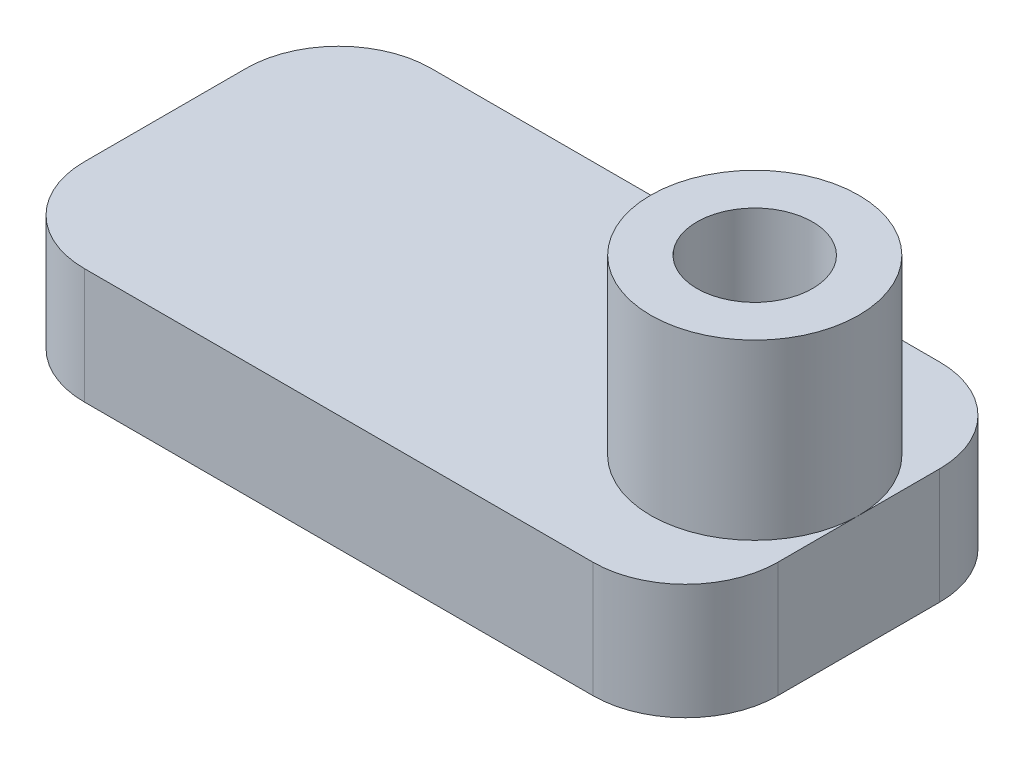
ISO-10303-21;
HEADER;
FILE_DESCRIPTION(('STEP AP214'),'2;1');
FILE_NAME('part.step','',(''),(''),'','','');
FILE_SCHEMA(('AUTOMOTIVE_DESIGN { 1 0 10303 214 1 1 1 1 }'));
ENDSEC;
DATA;
#1=APPLICATION_CONTEXT('core data for automotive mechanical design processes');
#2=APPLICATION_PROTOCOL_DEFINITION('international standard','automotive_design',2000,#1);
#3=PRODUCT_CONTEXT('',#1,'mechanical');
#4=PRODUCT('Part','Part','',(#3));
#5=PRODUCT_RELATED_PRODUCT_CATEGORY('part','',(#4));
#6=PRODUCT_DEFINITION_FORMATION('','',#4);
#7=PRODUCT_DEFINITION_CONTEXT('part definition',#1,'design');
#8=PRODUCT_DEFINITION('design','',#6,#7);
#9=PRODUCT_DEFINITION_SHAPE('','',#8);
#10=(LENGTH_UNIT() NAMED_UNIT(*) SI_UNIT(.MILLI.,.METRE.));
#11=(NAMED_UNIT(*) PLANE_ANGLE_UNIT() SI_UNIT($,.RADIAN.));
#12=(NAMED_UNIT(*) SI_UNIT($,.STERADIAN.) SOLID_ANGLE_UNIT());
#13=UNCERTAINTY_MEASURE_WITH_UNIT(LENGTH_MEASURE(1.E-05),#10,'distance_accuracy_value','');
#14=(GEOMETRIC_REPRESENTATION_CONTEXT(3) GLOBAL_UNCERTAINTY_ASSIGNED_CONTEXT((#13)) GLOBAL_UNIT_ASSIGNED_CONTEXT((#10,
#11,#12)) REPRESENTATION_CONTEXT('',''));
#15=CARTESIAN_POINT('',(0.,0.,0.));
#16=DIRECTION('',(0.,0.,1.));
#17=DIRECTION('',(1.,0.,0.));
#18=AXIS2_PLACEMENT_3D('',#15,#16,#17);
#19=CARTESIAN_POINT('',(9.,10.,0.));
#20=DIRECTION('',(1.,0.,0.));
#21=DIRECTION('',(0.,0.,-1.));
#22=AXIS2_PLACEMENT_3D('',#19,#20,#21);
#23=PLANE('',#22);
#24=DIRECTION('',(0.,0.,1.));
#25=VECTOR('',#24,1.);
#26=CARTESIAN_POINT('',(9.,10.,0.));
#27=LINE('',#26,#25);
#28=CARTESIAN_POINT('',(9.,10.,-7.));
#29=VERTEX_POINT('',#28);
#30=CARTESIAN_POINT('',(9.,10.,0.));
#31=VERTEX_POINT('',#30);
#32=EDGE_CURVE('E219',#29,#31,#27,.T.);
#33=ORIENTED_EDGE('',*,*,#32,.T.);
#34=CARTESIAN_POINT('',(9.,10.,7.));
#35=VERTEX_POINT('',#34);
#36=EDGE_CURVE('E136',#31,#35,#27,.T.);
#37=ORIENTED_EDGE('',*,*,#36,.T.);
#38=DIRECTION('',(0.,-1.,0.));
#39=VECTOR('',#38,1.);
#40=CARTESIAN_POINT('',(9.,0.,7.));
#41=LINE('',#40,#39);
#42=CARTESIAN_POINT('',(9.,0.,7.));
#43=VERTEX_POINT('',#42);
#44=EDGE_CURVE('E45',#35,#43,#41,.T.);
#45=ORIENTED_EDGE('',*,*,#44,.T.);
#46=DIRECTION('',(0.,0.,1.));
#47=VECTOR('',#46,1.);
#48=CARTESIAN_POINT('',(9.,0.,0.));
#49=LINE('',#48,#47);
#50=CARTESIAN_POINT('',(9.,0.,-7.));
#51=VERTEX_POINT('',#50);
#52=EDGE_CURVE('E167',#51,#43,#49,.T.);
#53=ORIENTED_EDGE('',*,*,#52,.F.);
#54=DIRECTION('',(0.,-1.,0.));
#55=VECTOR('',#54,1.);
#56=CARTESIAN_POINT('',(9.,10.,-7.));
#57=LINE('',#56,#55);
#58=EDGE_CURVE('E11',#51,#29,#57,.F.);
#59=ORIENTED_EDGE('',*,*,#58,.T.);
#60=EDGE_LOOP('',(#33,#37,#45,#53,#59));
#61=FACE_BOUND('',#60,.T.);
#62=ADVANCED_FACE('F37',(#61),#23,.T.);
#63=CARTESIAN_POINT('',(0.,10.,-15.));
#64=DIRECTION('',(0.,0.,-1.));
#65=DIRECTION('',(-1.,0.,0.));
#66=AXIS2_PLACEMENT_3D('',#63,#64,#65);
#67=PLANE('',#66);
#68=DIRECTION('',(1.,0.,0.));
#69=VECTOR('',#68,1.);
#70=CARTESIAN_POINT('',(0.,0.,-15.));
#71=LINE('',#70,#69);
#72=CARTESIAN_POINT('',(-43.,0.,-15.));
#73=VERTEX_POINT('',#72);
#74=CARTESIAN_POINT('',(1.,0.,-15.));
#75=VERTEX_POINT('',#74);
#76=EDGE_CURVE('E138',#73,#75,#71,.T.);
#77=ORIENTED_EDGE('',*,*,#76,.F.);
#78=DIRECTION('',(0.,-1.,0.));
#79=VECTOR('',#78,1.);
#80=CARTESIAN_POINT('',(-43.,10.,-15.));
#81=LINE('',#80,#79);
#82=CARTESIAN_POINT('',(-43.,10.,-15.));
#83=VERTEX_POINT('',#82);
#84=EDGE_CURVE('E161',#73,#83,#81,.F.);
#85=ORIENTED_EDGE('',*,*,#84,.T.);
#86=DIRECTION('',(1.,0.,0.));
#87=VECTOR('',#86,1.);
#88=CARTESIAN_POINT('',(0.,10.,-15.));
#89=LINE('',#88,#87);
#90=CARTESIAN_POINT('',(1.,10.,-15.));
#91=VERTEX_POINT('',#90);
#92=EDGE_CURVE('E176',#83,#91,#89,.T.);
#93=ORIENTED_EDGE('',*,*,#92,.T.);
#94=DIRECTION('',(0.,-1.,0.));
#95=VECTOR('',#94,1.);
#96=CARTESIAN_POINT('',(1.,10.,-15.));
#97=LINE('',#96,#95);
#98=EDGE_CURVE('E158',#91,#75,#97,.T.);
#99=ORIENTED_EDGE('',*,*,#98,.T.);
#100=EDGE_LOOP('',(#77,#85,#93,#99));
#101=FACE_BOUND('',#100,.T.);
#102=ADVANCED_FACE('F184',(#101),#67,.T.);
#103=CARTESIAN_POINT('',(-51.,10.,0.));
#104=DIRECTION('',(1.,0.,0.));
#105=DIRECTION('',(0.,0.,-1.));
#106=AXIS2_PLACEMENT_3D('',#103,#104,#105);
#107=PLANE('',#106);
#108=DIRECTION('',(0.,0.,1.));
#109=VECTOR('',#108,1.);
#110=CARTESIAN_POINT('',(-51.,0.,0.));
#111=LINE('',#110,#109);
#112=CARTESIAN_POINT('',(-51.,0.,-7.));
#113=VERTEX_POINT('',#112);
#114=CARTESIAN_POINT('',(-51.,0.,7.));
#115=VERTEX_POINT('',#114);
#116=EDGE_CURVE('E133',#113,#115,#111,.T.);
#117=ORIENTED_EDGE('',*,*,#116,.T.);
#118=DIRECTION('',(0.,-1.,0.));
#119=VECTOR('',#118,1.);
#120=CARTESIAN_POINT('',(-51.,10.,7.));
#121=LINE('',#120,#119);
#122=CARTESIAN_POINT('',(-51.,10.,7.));
#123=VERTEX_POINT('',#122);
#124=EDGE_CURVE('E110',#115,#123,#121,.F.);
#125=ORIENTED_EDGE('',*,*,#124,.T.);
#126=DIRECTION('',(0.,0.,1.));
#127=VECTOR('',#126,1.);
#128=CARTESIAN_POINT('',(-51.,10.,0.));
#129=LINE('',#128,#127);
#130=CARTESIAN_POINT('',(-51.,10.,-7.));
#131=VERTEX_POINT('',#130);
#132=EDGE_CURVE('E174',#131,#123,#129,.T.);
#133=ORIENTED_EDGE('',*,*,#132,.F.);
#134=DIRECTION('',(0.,-1.,0.));
#135=VECTOR('',#134,1.);
#136=CARTESIAN_POINT('',(-51.,0.,-7.));
#137=LINE('',#136,#135);
#138=EDGE_CURVE('E115',#131,#113,#137,.T.);
#139=ORIENTED_EDGE('',*,*,#138,.T.);
#140=EDGE_LOOP('',(#117,#125,#133,#139));
#141=FACE_BOUND('',#140,.T.);
#142=ADVANCED_FACE('F192',(#141),#107,.F.);
#143=CARTESIAN_POINT('',(0.,10.,15.));
#144=DIRECTION('',(0.,0.,-1.));
#145=DIRECTION('',(-1.,0.,0.));
#146=AXIS2_PLACEMENT_3D('',#143,#144,#145);
#147=PLANE('',#146);
#148=DIRECTION('',(1.,0.,0.));
#149=VECTOR('',#148,1.);
#150=CARTESIAN_POINT('',(0.,10.,15.));
#151=LINE('',#150,#149);
#152=CARTESIAN_POINT('',(-43.,10.,15.));
#153=VERTEX_POINT('',#152);
#154=CARTESIAN_POINT('',(1.,10.,15.));
#155=VERTEX_POINT('',#154);
#156=EDGE_CURVE('E125',#153,#155,#151,.T.);
#157=ORIENTED_EDGE('',*,*,#156,.F.);
#158=DIRECTION('',(0.,-1.,0.));
#159=VECTOR('',#158,1.);
#160=CARTESIAN_POINT('',(-43.,10.,15.));
#161=LINE('',#160,#159);
#162=CARTESIAN_POINT('',(-43.,0.,15.));
#163=VERTEX_POINT('',#162);
#164=EDGE_CURVE('E109',#153,#163,#161,.T.);
#165=ORIENTED_EDGE('',*,*,#164,.T.);
#166=DIRECTION('',(1.,0.,0.));
#167=VECTOR('',#166,1.);
#168=CARTESIAN_POINT('',(0.,0.,15.));
#169=LINE('',#168,#167);
#170=CARTESIAN_POINT('',(1.,0.,15.));
#171=VERTEX_POINT('',#170);
#172=EDGE_CURVE('E122',#163,#171,#169,.T.);
#173=ORIENTED_EDGE('',*,*,#172,.T.);
#174=DIRECTION('',(0.,-1.,0.));
#175=VECTOR('',#174,1.);
#176=CARTESIAN_POINT('',(1.,10.,15.));
#177=LINE('',#176,#175);
#178=EDGE_CURVE('E127',#171,#155,#177,.F.);
#179=ORIENTED_EDGE('',*,*,#178,.T.);
#180=EDGE_LOOP('',(#157,#165,#173,#179));
#181=FACE_BOUND('',#180,.T.);
#182=ADVANCED_FACE('F121',(#181),#147,.F.);
#183=CARTESIAN_POINT('',(0.,10.,0.));
#184=DIRECTION('',(0.,-1.,0.));
#185=DIRECTION('',(0.,0.,-1.));
#186=AXIS2_PLACEMENT_3D('',#183,#184,#185);
#187=CYLINDRICAL_SURFACE('',#186,5.);
#188=CARTESIAN_POINT('',(0.,0.,0.));
#189=DIRECTION('',(0.,1.,0.));
#190=DIRECTION('',(0.,0.,1.));
#191=AXIS2_PLACEMENT_3D('',#188,#189,#190);
#192=CIRCLE('',#191,5.);
#193=CARTESIAN_POINT('',(0.,0.,5.));
#194=VERTEX_POINT('',#193);
#195=EDGE_CURVE('E132',#194,#194,#192,.T.);
#196=ORIENTED_EDGE('',*,*,#195,.F.);
#197=EDGE_LOOP('',(#196));
#198=FACE_BOUND('',#197,.T.);
#199=CARTESIAN_POINT('',(0.,25.,0.));
#200=DIRECTION('',(0.,1.,0.));
#201=DIRECTION('',(0.,0.,1.));
#202=AXIS2_PLACEMENT_3D('',#199,#200,#201);
#203=CIRCLE('',#202,5.);
#204=CARTESIAN_POINT('',(0.,25.,5.));
#205=VERTEX_POINT('',#204);
#206=EDGE_CURVE('E226',#205,#205,#203,.T.);
#207=ORIENTED_EDGE('',*,*,#206,.T.);
#208=EDGE_LOOP('',(#207));
#209=FACE_BOUND('',#208,.T.);
#210=ADVANCED_FACE('F199',(#198,#209),#187,.F.);
#211=CARTESIAN_POINT('',(0.,10.,0.));
#212=DIRECTION('',(0.,1.,0.));
#213=DIRECTION('',(0.,0.,1.));
#214=AXIS2_PLACEMENT_3D('',#211,#212,#213);
#215=PLANE('',#214);
#216=ORIENTED_EDGE('',*,*,#36,.F.);
#217=CARTESIAN_POINT('',(0.,10.,0.));
#218=DIRECTION('',(0.,1.,0.));
#219=DIRECTION('',(0.,0.,1.));
#220=AXIS2_PLACEMENT_3D('',#217,#218,#219);
#221=CIRCLE('',#220,9.);
#222=EDGE_CURVE('E50',#31,#31,#221,.F.);
#223=ORIENTED_EDGE('',*,*,#222,.T.);
#224=ORIENTED_EDGE('',*,*,#32,.F.);
#225=CARTESIAN_POINT('',(1.,10.,-7.));
#226=DIRECTION('',(0.,1.,0.));
#227=DIRECTION('',(0.,0.,1.));
#228=AXIS2_PLACEMENT_3D('',#225,#226,#227);
#229=CIRCLE('',#228,8.);
#230=EDGE_CURVE('E57',#29,#91,#229,.T.);
#231=ORIENTED_EDGE('',*,*,#230,.T.);
#232=ORIENTED_EDGE('',*,*,#92,.F.);
#233=CARTESIAN_POINT('',(-43.,10.,-7.));
#234=DIRECTION('',(0.,1.,0.));
#235=DIRECTION('',(0.,0.,1.));
#236=AXIS2_PLACEMENT_3D('',#233,#234,#235);
#237=CIRCLE('',#236,8.);
#238=EDGE_CURVE('E154',#83,#131,#237,.T.);
#239=ORIENTED_EDGE('',*,*,#238,.T.);
#240=ORIENTED_EDGE('',*,*,#132,.T.);
#241=CARTESIAN_POINT('',(-43.,10.,7.));
#242=DIRECTION('',(0.,1.,0.));
#243=DIRECTION('',(0.,0.,1.));
#244=AXIS2_PLACEMENT_3D('',#241,#242,#243);
#245=CIRCLE('',#244,8.);
#246=EDGE_CURVE('E156',#123,#153,#245,.T.);
#247=ORIENTED_EDGE('',*,*,#246,.T.);
#248=ORIENTED_EDGE('',*,*,#156,.T.);
#249=CARTESIAN_POINT('',(1.,10.,7.));
#250=DIRECTION('',(0.,1.,0.));
#251=DIRECTION('',(0.,0.,1.));
#252=AXIS2_PLACEMENT_3D('',#249,#250,#251);
#253=CIRCLE('',#252,8.);
#254=EDGE_CURVE('E150',#155,#35,#253,.T.);
#255=ORIENTED_EDGE('',*,*,#254,.T.);
#256=EDGE_LOOP('',(#216,#223,#224,#231,#232,#239,#240,#247,#248,#255));
#257=FACE_BOUND('',#256,.T.);
#258=ADVANCED_FACE('F172',(#257),#215,.T.);
#259=CARTESIAN_POINT('',(0.,0.,0.));
#260=DIRECTION('',(0.,1.,0.));
#261=DIRECTION('',(0.,0.,1.));
#262=AXIS2_PLACEMENT_3D('',#259,#260,#261);
#263=PLANE('',#262);
#264=ORIENTED_EDGE('',*,*,#52,.T.);
#265=CARTESIAN_POINT('',(1.,0.,7.));
#266=DIRECTION('',(0.,1.,0.));
#267=DIRECTION('',(0.,0.,1.));
#268=AXIS2_PLACEMENT_3D('',#265,#266,#267);
#269=CIRCLE('',#268,8.);
#270=EDGE_CURVE('E126',#43,#171,#269,.F.);
#271=ORIENTED_EDGE('',*,*,#270,.T.);
#272=ORIENTED_EDGE('',*,*,#172,.F.);
#273=CARTESIAN_POINT('',(-43.,0.,7.));
#274=DIRECTION('',(0.,1.,0.));
#275=DIRECTION('',(0.,0.,1.));
#276=AXIS2_PLACEMENT_3D('',#273,#274,#275);
#277=CIRCLE('',#276,8.);
#278=EDGE_CURVE('E105',#163,#115,#277,.F.);
#279=ORIENTED_EDGE('',*,*,#278,.T.);
#280=ORIENTED_EDGE('',*,*,#116,.F.);
#281=CARTESIAN_POINT('',(-43.,0.,-7.));
#282=DIRECTION('',(0.,1.,0.));
#283=DIRECTION('',(0.,0.,1.));
#284=AXIS2_PLACEMENT_3D('',#281,#282,#283);
#285=CIRCLE('',#284,8.);
#286=EDGE_CURVE('E116',#113,#73,#285,.F.);
#287=ORIENTED_EDGE('',*,*,#286,.T.);
#288=ORIENTED_EDGE('',*,*,#76,.T.);
#289=CARTESIAN_POINT('',(1.,0.,-7.));
#290=DIRECTION('',(0.,1.,0.));
#291=DIRECTION('',(0.,0.,1.));
#292=AXIS2_PLACEMENT_3D('',#289,#290,#291);
#293=CIRCLE('',#292,8.);
#294=EDGE_CURVE('E144',#75,#51,#293,.F.);
#295=ORIENTED_EDGE('',*,*,#294,.T.);
#296=EDGE_LOOP('',(#264,#271,#272,#279,#280,#287,#288,#295));
#297=FACE_BOUND('',#296,.T.);
#298=ORIENTED_EDGE('',*,*,#195,.T.);
#299=EDGE_LOOP('',(#298));
#300=FACE_BOUND('',#299,.T.);
#301=ADVANCED_FACE('F129',(#297,#300),#263,.F.);
#302=CARTESIAN_POINT('',(-43.,10.,7.));
#303=DIRECTION('',(0.,-1.,0.));
#304=DIRECTION('',(0.,0.,-1.));
#305=AXIS2_PLACEMENT_3D('',#302,#303,#304);
#306=CYLINDRICAL_SURFACE('',#305,8.);
#307=ORIENTED_EDGE('',*,*,#246,.F.);
#308=ORIENTED_EDGE('',*,*,#124,.F.);
#309=ORIENTED_EDGE('',*,*,#278,.F.);
#310=ORIENTED_EDGE('',*,*,#164,.F.);
#311=EDGE_LOOP('',(#307,#308,#309,#310));
#312=FACE_BOUND('',#311,.T.);
#313=ADVANCED_FACE('F108',(#312),#306,.T.);
#314=CARTESIAN_POINT('',(-43.,10.,-7.));
#315=DIRECTION('',(0.,1.,0.));
#316=DIRECTION('',(0.,0.,1.));
#317=AXIS2_PLACEMENT_3D('',#314,#315,#316);
#318=CYLINDRICAL_SURFACE('',#317,8.);
#319=ORIENTED_EDGE('',*,*,#238,.F.);
#320=ORIENTED_EDGE('',*,*,#84,.F.);
#321=ORIENTED_EDGE('',*,*,#286,.F.);
#322=ORIENTED_EDGE('',*,*,#138,.F.);
#323=EDGE_LOOP('',(#319,#320,#321,#322));
#324=FACE_BOUND('',#323,.T.);
#325=ADVANCED_FACE('F188',(#324),#318,.T.);
#326=CARTESIAN_POINT('',(1.,10.,-7.));
#327=DIRECTION('',(0.,-1.,0.));
#328=DIRECTION('',(0.,0.,-1.));
#329=AXIS2_PLACEMENT_3D('',#326,#327,#328);
#330=CYLINDRICAL_SURFACE('',#329,8.);
#331=ORIENTED_EDGE('',*,*,#230,.F.);
#332=ORIENTED_EDGE('',*,*,#58,.F.);
#333=ORIENTED_EDGE('',*,*,#294,.F.);
#334=ORIENTED_EDGE('',*,*,#98,.F.);
#335=EDGE_LOOP('',(#331,#332,#333,#334));
#336=FACE_BOUND('',#335,.T.);
#337=ADVANCED_FACE('F212',(#336),#330,.T.);
#338=CARTESIAN_POINT('',(1.,10.,7.));
#339=DIRECTION('',(0.,1.,0.));
#340=DIRECTION('',(0.,0.,1.));
#341=AXIS2_PLACEMENT_3D('',#338,#339,#340);
#342=CYLINDRICAL_SURFACE('',#341,8.);
#343=ORIENTED_EDGE('',*,*,#254,.F.);
#344=ORIENTED_EDGE('',*,*,#178,.F.);
#345=ORIENTED_EDGE('',*,*,#270,.F.);
#346=ORIENTED_EDGE('',*,*,#44,.F.);
#347=EDGE_LOOP('',(#343,#344,#345,#346));
#348=FACE_BOUND('',#347,.T.);
#349=ADVANCED_FACE('F39',(#348),#342,.T.);
#350=CARTESIAN_POINT('',(0.,25.,0.));
#351=DIRECTION('',(0.,-1.,0.));
#352=DIRECTION('',(0.,0.,-1.));
#353=AXIS2_PLACEMENT_3D('',#350,#351,#352);
#354=CYLINDRICAL_SURFACE('',#353,9.);
#355=ORIENTED_EDGE('',*,*,#222,.F.);
#356=EDGE_LOOP('',(#355));
#357=FACE_BOUND('',#356,.T.);
#358=CARTESIAN_POINT('',(0.,25.,0.));
#359=DIRECTION('',(0.,1.,0.));
#360=DIRECTION('',(0.,0.,1.));
#361=AXIS2_PLACEMENT_3D('',#358,#359,#360);
#362=CIRCLE('',#361,9.);
#363=CARTESIAN_POINT('',(0.,25.,9.));
#364=VERTEX_POINT('',#363);
#365=EDGE_CURVE('E223',#364,#364,#362,.T.);
#366=ORIENTED_EDGE('',*,*,#365,.F.);
#367=EDGE_LOOP('',(#366));
#368=FACE_BOUND('',#367,.T.);
#369=ADVANCED_FACE('F218',(#357,#368),#354,.T.);
#370=CARTESIAN_POINT('',(0.,25.,0.));
#371=DIRECTION('',(0.,1.,0.));
#372=DIRECTION('',(0.,0.,1.));
#373=AXIS2_PLACEMENT_3D('',#370,#371,#372);
#374=PLANE('',#373);
#375=ORIENTED_EDGE('',*,*,#206,.F.);
#376=EDGE_LOOP('',(#375));
#377=FACE_BOUND('',#376,.T.);
#378=ORIENTED_EDGE('',*,*,#365,.T.);
#379=EDGE_LOOP('',(#378));
#380=FACE_BOUND('',#379,.T.);
#381=ADVANCED_FACE('F231',(#377,#380),#374,.T.);
#382=CLOSED_SHELL('',(#62,#102,#142,#182,#210,#258,#301,#313,#325,#337,#349,#369,#381));
#383=MANIFOLD_SOLID_BREP('B2',#382);
#384=ADVANCED_BREP_SHAPE_REPRESENTATION('',(#18,#383),#14);
#385=SHAPE_DEFINITION_REPRESENTATION(#9,#384);
ENDSEC;
END-ISO-10303-21;
